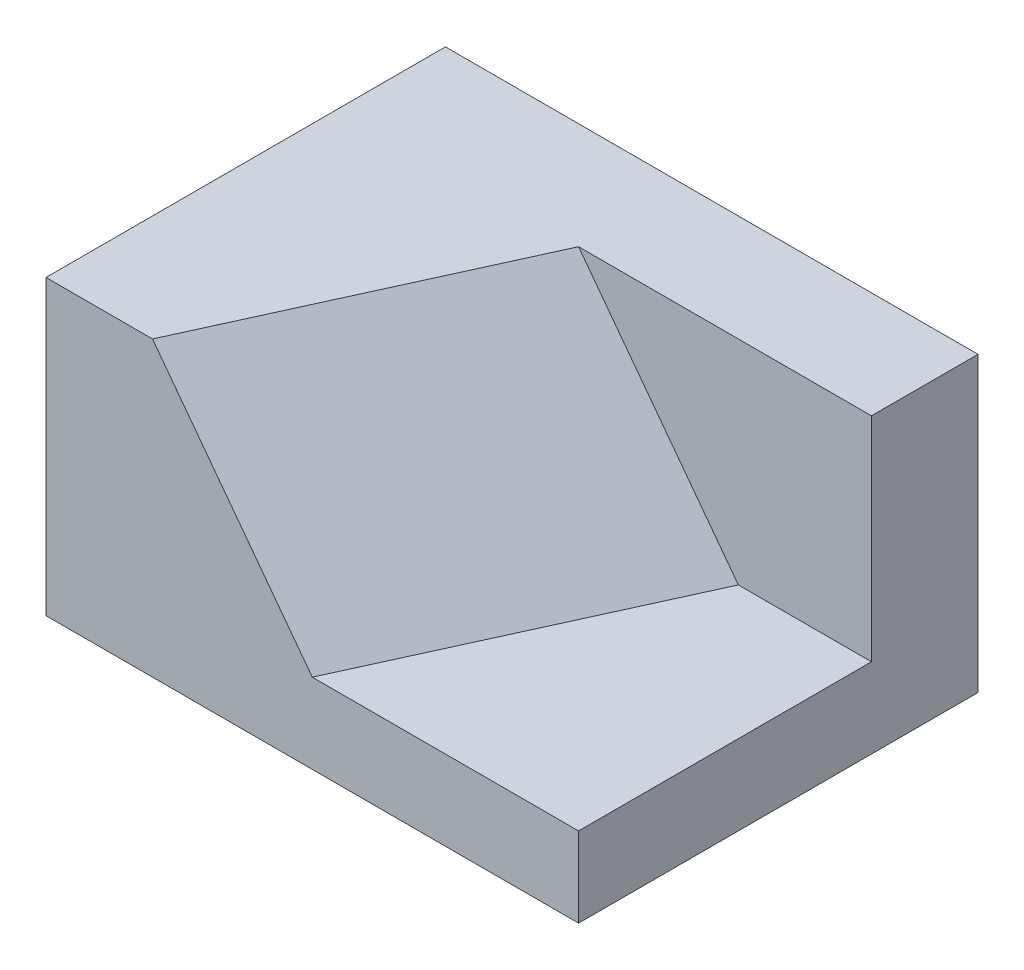
ISO-10303-21;
HEADER;
FILE_DESCRIPTION(('STEP AP214'),'2;1');
FILE_NAME('part.step','',(''),(''),'','','');
FILE_SCHEMA(('AUTOMOTIVE_DESIGN { 1 0 10303 214 1 1 1 1 }'));
ENDSEC;
DATA;
#1=APPLICATION_CONTEXT('core data for automotive mechanical design processes');
#2=APPLICATION_PROTOCOL_DEFINITION('international standard','automotive_design',2000,#1);
#3=PRODUCT_CONTEXT('',#1,'mechanical');
#4=PRODUCT('Part','Part','',(#3));
#5=PRODUCT_RELATED_PRODUCT_CATEGORY('part','',(#4));
#6=PRODUCT_DEFINITION_FORMATION('','',#4);
#7=PRODUCT_DEFINITION_CONTEXT('part definition',#1,'design');
#8=PRODUCT_DEFINITION('design','',#6,#7);
#9=PRODUCT_DEFINITION_SHAPE('','',#8);
#10=(LENGTH_UNIT() NAMED_UNIT(*) SI_UNIT(.MILLI.,.METRE.));
#11=(NAMED_UNIT(*) PLANE_ANGLE_UNIT() SI_UNIT($,.RADIAN.));
#12=(NAMED_UNIT(*) SI_UNIT($,.STERADIAN.) SOLID_ANGLE_UNIT());
#13=UNCERTAINTY_MEASURE_WITH_UNIT(LENGTH_MEASURE(1.E-05),#10,'distance_accuracy_value','');
#14=(GEOMETRIC_REPRESENTATION_CONTEXT(3) GLOBAL_UNCERTAINTY_ASSIGNED_CONTEXT((#13)) GLOBAL_UNIT_ASSIGNED_CONTEXT((#10,
#11,#12)) REPRESENTATION_CONTEXT('',''));
#15=CARTESIAN_POINT('',(0.,0.,0.));
#16=DIRECTION('',(0.,0.,1.));
#17=DIRECTION('',(1.,0.,0.));
#18=AXIS2_PLACEMENT_3D('',#15,#16,#17);
#19=CARTESIAN_POINT('',(100.,0.,20.));
#20=DIRECTION('',(0.,0.,-1.));
#21=DIRECTION('',(0.,1.,0.));
#22=AXIS2_PLACEMENT_3D('',#19,#20,#21);
#23=PLANE('',#22);
#24=DIRECTION('',(-1.,0.,0.));
#25=VECTOR('',#24,1.);
#26=CARTESIAN_POINT('',(100.,55.,20.));
#27=LINE('',#26,#25);
#28=CARTESIAN_POINT('',(100.,55.,20.));
#29=VERTEX_POINT('',#28);
#30=CARTESIAN_POINT('',(45.,55.,20.));
#31=VERTEX_POINT('',#30);
#32=EDGE_CURVE('E133',#29,#31,#27,.T.);
#33=ORIENTED_EDGE('',*,*,#32,.T.);
#34=DIRECTION('',(0.600000000000001,-0.799999999999999,0.));
#35=VECTOR('',#34,1.);
#36=CARTESIAN_POINT('',(45.,55.,20.));
#37=LINE('',#36,#35);
#38=CARTESIAN_POINT('',(75.,15.,20.));
#39=VERTEX_POINT('',#38);
#40=EDGE_CURVE('E174',#31,#39,#37,.T.);
#41=ORIENTED_EDGE('',*,*,#40,.T.);
#42=DIRECTION('',(-1.,0.,0.));
#43=VECTOR('',#42,1.);
#44=CARTESIAN_POINT('',(100.,15.,20.));
#45=LINE('',#44,#43);
#46=CARTESIAN_POINT('',(100.,15.,20.));
#47=VERTEX_POINT('',#46);
#48=EDGE_CURVE('E11',#47,#39,#45,.T.);
#49=ORIENTED_EDGE('',*,*,#48,.F.);
#50=DIRECTION('',(0.,-1.,0.));
#51=VECTOR('',#50,1.);
#52=CARTESIAN_POINT('',(100.,0.,20.));
#53=LINE('',#52,#51);
#54=EDGE_CURVE('E147',#29,#47,#53,.T.);
#55=ORIENTED_EDGE('',*,*,#54,.F.);
#56=EDGE_LOOP('',(#33,#41,#49,#55));
#57=FACE_BOUND('',#56,.T.);
#58=ADVANCED_FACE('F45',(#57),#23,.F.);
#59=CARTESIAN_POINT('',(100.,15.,0.));
#60=DIRECTION('',(0.,-1.,0.));
#61=DIRECTION('',(0.,0.,-1.));
#62=AXIS2_PLACEMENT_3D('',#59,#60,#61);
#63=PLANE('',#62);
#64=ORIENTED_EDGE('',*,*,#48,.T.);
#65=DIRECTION('',(-0.413802944301184,0.,0.910366477462605));
#66=VECTOR('',#65,1.);
#67=CARTESIAN_POINT('',(75.,15.,20.));
#68=LINE('',#67,#66);
#69=CARTESIAN_POINT('',(50.,15.,75.));
#70=VERTEX_POINT('',#69);
#71=EDGE_CURVE('E60',#39,#70,#68,.T.);
#72=ORIENTED_EDGE('',*,*,#71,.T.);
#73=DIRECTION('',(-1.,0.,0.));
#74=VECTOR('',#73,1.);
#75=CARTESIAN_POINT('',(100.,15.,75.));
#76=LINE('',#75,#74);
#77=CARTESIAN_POINT('',(100.,15.,75.));
#78=VERTEX_POINT('',#77);
#79=EDGE_CURVE('E53',#78,#70,#76,.T.);
#80=ORIENTED_EDGE('',*,*,#79,.F.);
#81=DIRECTION('',(0.,0.,1.));
#82=VECTOR('',#81,1.);
#83=CARTESIAN_POINT('',(100.,15.,0.));
#84=LINE('',#83,#82);
#85=EDGE_CURVE('E95',#47,#78,#84,.T.);
#86=ORIENTED_EDGE('',*,*,#85,.F.);
#87=EDGE_LOOP('',(#64,#72,#80,#86));
#88=FACE_BOUND('',#87,.T.);
#89=ADVANCED_FACE('F171',(#88),#63,.F.);
#90=CARTESIAN_POINT('',(100.,0.,75.));
#91=DIRECTION('',(0.,0.,1.));
#92=DIRECTION('',(1.,0.,0.));
#93=AXIS2_PLACEMENT_3D('',#90,#91,#92);
#94=PLANE('',#93);
#95=ORIENTED_EDGE('',*,*,#79,.T.);
#96=DIRECTION('',(-0.600000000000001,0.8,0.));
#97=VECTOR('',#96,1.);
#98=CARTESIAN_POINT('',(50.,15.,75.));
#99=LINE('',#98,#97);
#100=CARTESIAN_POINT('',(20.,55.,75.));
#101=VERTEX_POINT('',#100);
#102=EDGE_CURVE('E162',#70,#101,#99,.T.);
#103=ORIENTED_EDGE('',*,*,#102,.T.);
#104=DIRECTION('',(-1.,0.,0.));
#105=VECTOR('',#104,1.);
#106=CARTESIAN_POINT('',(75.,55.,75.));
#107=LINE('',#106,#105);
#108=CARTESIAN_POINT('',(0.,55.,75.));
#109=VERTEX_POINT('',#108);
#110=EDGE_CURVE('E138',#101,#109,#107,.T.);
#111=ORIENTED_EDGE('',*,*,#110,.T.);
#112=DIRECTION('',(0.,1.,0.));
#113=VECTOR('',#112,1.);
#114=CARTESIAN_POINT('',(0.,0.,75.));
#115=LINE('',#114,#113);
#116=CARTESIAN_POINT('',(0.,0.,75.));
#117=VERTEX_POINT('',#116);
#118=EDGE_CURVE('E134',#117,#109,#115,.T.);
#119=ORIENTED_EDGE('',*,*,#118,.F.);
#120=DIRECTION('',(-1.,0.,0.));
#121=VECTOR('',#120,1.);
#122=CARTESIAN_POINT('',(100.,0.,75.));
#123=LINE('',#122,#121);
#124=CARTESIAN_POINT('',(100.,0.,75.));
#125=VERTEX_POINT('',#124);
#126=EDGE_CURVE('E114',#125,#117,#123,.T.);
#127=ORIENTED_EDGE('',*,*,#126,.F.);
#128=DIRECTION('',(0.,1.,0.));
#129=VECTOR('',#128,1.);
#130=CARTESIAN_POINT('',(100.,0.,75.));
#131=LINE('',#130,#129);
#132=EDGE_CURVE('E124',#125,#78,#131,.T.);
#133=ORIENTED_EDGE('',*,*,#132,.T.);
#134=EDGE_LOOP('',(#95,#103,#111,#119,#127,#133));
#135=FACE_BOUND('',#134,.T.);
#136=ADVANCED_FACE('F159',(#135),#94,.T.);
#137=CARTESIAN_POINT('',(100.,0.,0.));
#138=DIRECTION('',(0.,-1.,0.));
#139=DIRECTION('',(0.,0.,-1.));
#140=AXIS2_PLACEMENT_3D('',#137,#138,#139);
#141=PLANE('',#140);
#142=DIRECTION('',(0.,0.,1.));
#143=VECTOR('',#142,1.);
#144=CARTESIAN_POINT('',(0.,0.,0.));
#145=LINE('',#144,#143);
#146=CARTESIAN_POINT('',(0.,0.,0.));
#147=VERTEX_POINT('',#146);
#148=EDGE_CURVE('E112',#147,#117,#145,.T.);
#149=ORIENTED_EDGE('',*,*,#148,.F.);
#150=DIRECTION('',(-1.,0.,0.));
#151=VECTOR('',#150,1.);
#152=CARTESIAN_POINT('',(100.,0.,0.));
#153=LINE('',#152,#151);
#154=CARTESIAN_POINT('',(100.,0.,0.));
#155=VERTEX_POINT('',#154);
#156=EDGE_CURVE('E106',#155,#147,#153,.T.);
#157=ORIENTED_EDGE('',*,*,#156,.F.);
#158=DIRECTION('',(0.,0.,1.));
#159=VECTOR('',#158,1.);
#160=CARTESIAN_POINT('',(100.,0.,0.));
#161=LINE('',#160,#159);
#162=EDGE_CURVE('E110',#155,#125,#161,.T.);
#163=ORIENTED_EDGE('',*,*,#162,.T.);
#164=ORIENTED_EDGE('',*,*,#126,.T.);
#165=EDGE_LOOP('',(#149,#157,#163,#164));
#166=FACE_BOUND('',#165,.T.);
#167=ADVANCED_FACE('F108',(#166),#141,.T.);
#168=CARTESIAN_POINT('',(100.,0.,0.));
#169=DIRECTION('',(0.,0.,1.));
#170=DIRECTION('',(1.,0.,0.));
#171=AXIS2_PLACEMENT_3D('',#168,#169,#170);
#172=PLANE('',#171);
#173=DIRECTION('',(0.,1.,0.));
#174=VECTOR('',#173,1.);
#175=CARTESIAN_POINT('',(0.,0.,0.));
#176=LINE('',#175,#174);
#177=CARTESIAN_POINT('',(0.,55.,0.));
#178=VERTEX_POINT('',#177);
#179=EDGE_CURVE('E87',#147,#178,#176,.T.);
#180=ORIENTED_EDGE('',*,*,#179,.T.);
#181=DIRECTION('',(-1.,0.,0.));
#182=VECTOR('',#181,1.);
#183=CARTESIAN_POINT('',(100.,55.,0.));
#184=LINE('',#183,#182);
#185=CARTESIAN_POINT('',(100.,55.,0.));
#186=VERTEX_POINT('',#185);
#187=EDGE_CURVE('E115',#186,#178,#184,.T.);
#188=ORIENTED_EDGE('',*,*,#187,.F.);
#189=DIRECTION('',(0.,1.,0.));
#190=VECTOR('',#189,1.);
#191=CARTESIAN_POINT('',(100.,0.,0.));
#192=LINE('',#191,#190);
#193=EDGE_CURVE('E117',#155,#186,#192,.T.);
#194=ORIENTED_EDGE('',*,*,#193,.F.);
#195=ORIENTED_EDGE('',*,*,#156,.T.);
#196=EDGE_LOOP('',(#180,#188,#194,#195));
#197=FACE_BOUND('',#196,.T.);
#198=ADVANCED_FACE('F118',(#197),#172,.F.);
#199=CARTESIAN_POINT('',(100.,55.,0.));
#200=DIRECTION('',(0.,-1.,0.));
#201=DIRECTION('',(0.,0.,-1.));
#202=AXIS2_PLACEMENT_3D('',#199,#200,#201);
#203=PLANE('',#202);
#204=DIRECTION('',(0.413802944301184,0.,-0.910366477462605));
#205=VECTOR('',#204,1.);
#206=CARTESIAN_POINT('',(20.,55.,75.));
#207=LINE('',#206,#205);
#208=EDGE_CURVE('E168',#101,#31,#207,.T.);
#209=ORIENTED_EDGE('',*,*,#208,.T.);
#210=ORIENTED_EDGE('',*,*,#32,.F.);
#211=DIRECTION('',(0.,0.,1.));
#212=VECTOR('',#211,1.);
#213=CARTESIAN_POINT('',(100.,55.,0.));
#214=LINE('',#213,#212);
#215=EDGE_CURVE('E69',#186,#29,#214,.T.);
#216=ORIENTED_EDGE('',*,*,#215,.F.);
#217=ORIENTED_EDGE('',*,*,#187,.T.);
#218=DIRECTION('',(0.,0.,1.));
#219=VECTOR('',#218,1.);
#220=CARTESIAN_POINT('',(0.,55.,0.));
#221=LINE('',#220,#219);
#222=EDGE_CURVE('E143',#178,#109,#221,.T.);
#223=ORIENTED_EDGE('',*,*,#222,.T.);
#224=ORIENTED_EDGE('',*,*,#110,.F.);
#225=EDGE_LOOP('',(#209,#210,#216,#217,#223,#224));
#226=FACE_BOUND('',#225,.T.);
#227=ADVANCED_FACE('F188',(#226),#203,.F.);
#228=CARTESIAN_POINT('',(100.,0.,0.));
#229=DIRECTION('',(1.,0.,0.));
#230=DIRECTION('',(0.,0.,-1.));
#231=AXIS2_PLACEMENT_3D('',#228,#229,#230);
#232=PLANE('',#231);
#233=ORIENTED_EDGE('',*,*,#54,.T.);
#234=ORIENTED_EDGE('',*,*,#85,.T.);
#235=ORIENTED_EDGE('',*,*,#132,.F.);
#236=ORIENTED_EDGE('',*,*,#162,.F.);
#237=ORIENTED_EDGE('',*,*,#193,.T.);
#238=ORIENTED_EDGE('',*,*,#215,.T.);
#239=EDGE_LOOP('',(#233,#234,#235,#236,#237,#238));
#240=FACE_BOUND('',#239,.T.);
#241=ADVANCED_FACE('F122',(#240),#232,.T.);
#242=CARTESIAN_POINT('',(0.,0.,0.));
#243=DIRECTION('',(1.,0.,0.));
#244=DIRECTION('',(0.,0.,-1.));
#245=AXIS2_PLACEMENT_3D('',#242,#243,#244);
#246=PLANE('',#245);
#247=ORIENTED_EDGE('',*,*,#118,.T.);
#248=ORIENTED_EDGE('',*,*,#222,.F.);
#249=ORIENTED_EDGE('',*,*,#179,.F.);
#250=ORIENTED_EDGE('',*,*,#148,.T.);
#251=EDGE_LOOP('',(#247,#248,#249,#250));
#252=FACE_BOUND('',#251,.T.);
#253=ADVANCED_FACE('F194',(#252),#246,.F.);
#254=CARTESIAN_POINT('',(53.8919708029197,40.4189781021898,24.4963503649635));
#255=DIRECTION('',(-0.751834738790749,-0.563876054093063,-0.341743063086704));
#256=DIRECTION('',(0.600000000000001,-0.8,0.));
#257=AXIS2_PLACEMENT_3D('',#254,#255,#256);
#258=PLANE('',#257);
#259=ORIENTED_EDGE('',*,*,#102,.F.);
#260=ORIENTED_EDGE('',*,*,#71,.F.);
#261=ORIENTED_EDGE('',*,*,#40,.F.);
#262=ORIENTED_EDGE('',*,*,#208,.F.);
#263=EDGE_LOOP('',(#259,#260,#261,#262));
#264=FACE_BOUND('',#263,.T.);
#265=ADVANCED_FACE('F166',(#264),#258,.F.);
#266=CLOSED_SHELL('',(#58,#89,#136,#167,#198,#227,#241,#253,#265));
#267=MANIFOLD_SOLID_BREP('B2',#266);
#268=ADVANCED_BREP_SHAPE_REPRESENTATION('',(#18,#267),#14);
#269=SHAPE_DEFINITION_REPRESENTATION(#9,#268);
ENDSEC;
END-ISO-10303-21;
